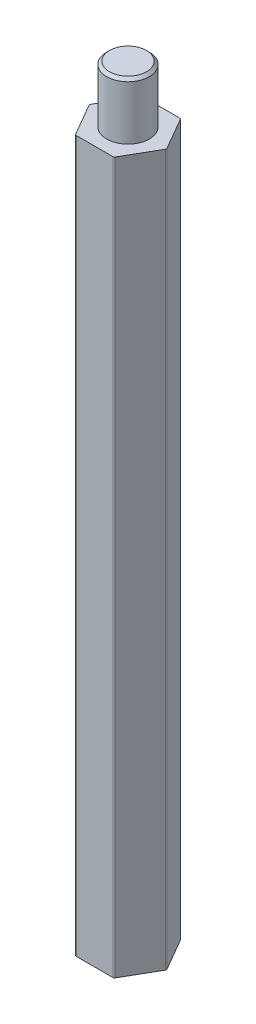
ISO-10303-21;
HEADER;
FILE_DESCRIPTION(('STEP AP214'),'2;1');
FILE_NAME('part.step','',(''),(''),'','','');
FILE_SCHEMA(('AUTOMOTIVE_DESIGN { 1 0 10303 214 1 1 1 1 }'));
ENDSEC;
DATA;
#1=APPLICATION_CONTEXT('core data for automotive mechanical design processes');
#2=APPLICATION_PROTOCOL_DEFINITION('international standard','automotive_design',2000,#1);
#3=PRODUCT_CONTEXT('',#1,'mechanical');
#4=PRODUCT('Part','Part','',(#3));
#5=PRODUCT_RELATED_PRODUCT_CATEGORY('part','',(#4));
#6=PRODUCT_DEFINITION_FORMATION('','',#4);
#7=PRODUCT_DEFINITION_CONTEXT('part definition',#1,'design');
#8=PRODUCT_DEFINITION('design','',#6,#7);
#9=PRODUCT_DEFINITION_SHAPE('','',#8);
#10=(LENGTH_UNIT() NAMED_UNIT(*) SI_UNIT(.MILLI.,.METRE.));
#11=(NAMED_UNIT(*) PLANE_ANGLE_UNIT() SI_UNIT($,.RADIAN.));
#12=(NAMED_UNIT(*) SI_UNIT($,.STERADIAN.) SOLID_ANGLE_UNIT());
#13=UNCERTAINTY_MEASURE_WITH_UNIT(LENGTH_MEASURE(1.E-05),#10,'distance_accuracy_value','');
#14=(GEOMETRIC_REPRESENTATION_CONTEXT(3) GLOBAL_UNCERTAINTY_ASSIGNED_CONTEXT((#13)) GLOBAL_UNIT_ASSIGNED_CONTEXT((#10,
#11,#12)) REPRESENTATION_CONTEXT('',''));
#15=CARTESIAN_POINT('',(0.,0.,0.));
#16=DIRECTION('',(0.,0.,1.));
#17=DIRECTION('',(1.,0.,0.));
#18=AXIS2_PLACEMENT_3D('',#15,#16,#17);
#19=CARTESIAN_POINT('',(1.35677313259565,50.,2.34999999999999));
#20=DIRECTION('',(-0.866025403784442,0.,-0.499999999999995));
#21=DIRECTION('',(-0.499999999999995,0.,0.866025403784442));
#22=AXIS2_PLACEMENT_3D('',#19,#20,#21);
#23=PLANE('',#22);
#24=DIRECTION('',(0.499999999999995,0.,-0.866025403784441));
#25=VECTOR('',#24,1.);
#26=CARTESIAN_POINT('',(1.35677313259565,50.,2.34999999999999));
#27=LINE('',#26,#25);
#28=CARTESIAN_POINT('',(1.38564064605513,50.,2.29999999999999));
#29=VERTEX_POINT('',#28);
#30=CARTESIAN_POINT('',(2.68467875173176,50.,0.0500000000000001));
#31=VERTEX_POINT('',#30);
#32=EDGE_CURVE('E152',#29,#31,#27,.T.);
#33=ORIENTED_EDGE('',*,*,#32,.F.);
#34=DIRECTION('',(0.,-1.,0.));
#35=VECTOR('',#34,1.);
#36=CARTESIAN_POINT('',(1.38564064605513,50.,2.29999999999999));
#37=LINE('',#36,#35);
#38=CARTESIAN_POINT('',(1.38564064605513,0.,2.29999999999999));
#39=VERTEX_POINT('',#38);
#40=EDGE_CURVE('E137',#29,#39,#37,.T.);
#41=ORIENTED_EDGE('',*,*,#40,.T.);
#42=DIRECTION('',(0.499999999999995,0.,-0.866025403784441));
#43=VECTOR('',#42,1.);
#44=CARTESIAN_POINT('',(1.35677313259565,0.,2.34999999999999));
#45=LINE('',#44,#43);
#46=CARTESIAN_POINT('',(2.68467875173176,0.,0.0500000000000001));
#47=VERTEX_POINT('',#46);
#48=EDGE_CURVE('E149',#39,#47,#45,.T.);
#49=ORIENTED_EDGE('',*,*,#48,.T.);
#50=DIRECTION('',(0.,-1.,0.));
#51=VECTOR('',#50,1.);
#52=CARTESIAN_POINT('',(2.68467875173176,50.,0.0499999999999997));
#53=LINE('',#52,#51);
#54=EDGE_CURVE('E154',#47,#31,#53,.F.);
#55=ORIENTED_EDGE('',*,*,#54,.T.);
#56=EDGE_LOOP('',(#33,#41,#49,#55));
#57=FACE_BOUND('',#56,.T.);
#58=ADVANCED_FACE('F43',(#57),#23,.F.);
#59=CARTESIAN_POINT('',(2.71354626519124,50.,0.));
#60=DIRECTION('',(-0.866025403784438,0.,0.500000000000001));
#61=DIRECTION('',(0.500000000000001,0.,0.866025403784438));
#62=AXIS2_PLACEMENT_3D('',#59,#60,#61);
#63=PLANE('',#62);
#64=DIRECTION('',(-0.500000000000001,0.,-0.866025403784438));
#65=VECTOR('',#64,1.);
#66=CARTESIAN_POINT('',(2.71354626519124,0.,0.));
#67=LINE('',#66,#65);
#68=CARTESIAN_POINT('',(2.68467875173176,0.,-0.0499999999999997));
#69=VERTEX_POINT('',#68);
#70=CARTESIAN_POINT('',(1.3856406460551,0.,-2.30000000000001));
#71=VERTEX_POINT('',#70);
#72=EDGE_CURVE('E158',#69,#71,#67,.T.);
#73=ORIENTED_EDGE('',*,*,#72,.T.);
#74=DIRECTION('',(0.,-1.,0.));
#75=VECTOR('',#74,1.);
#76=CARTESIAN_POINT('',(1.3856406460551,50.,-2.30000000000001));
#77=LINE('',#76,#75);
#78=CARTESIAN_POINT('',(1.3856406460551,50.,-2.30000000000001));
#79=VERTEX_POINT('',#78);
#80=EDGE_CURVE('E11',#71,#79,#77,.F.);
#81=ORIENTED_EDGE('',*,*,#80,.T.);
#82=DIRECTION('',(-0.500000000000001,0.,-0.866025403784438));
#83=VECTOR('',#82,1.);
#84=CARTESIAN_POINT('',(2.71354626519124,50.,0.));
#85=LINE('',#84,#83);
#86=CARTESIAN_POINT('',(2.68467875173176,50.,-0.0499999999999997));
#87=VERTEX_POINT('',#86);
#88=EDGE_CURVE('E235',#87,#79,#85,.T.);
#89=ORIENTED_EDGE('',*,*,#88,.F.);
#90=DIRECTION('',(0.,-1.,0.));
#91=VECTOR('',#90,1.);
#92=CARTESIAN_POINT('',(2.68467875173176,50.,-0.0499999999999997));
#93=LINE('',#92,#91);
#94=EDGE_CURVE('E51',#87,#69,#93,.T.);
#95=ORIENTED_EDGE('',*,*,#94,.T.);
#96=EDGE_LOOP('',(#73,#81,#89,#95));
#97=FACE_BOUND('',#96,.T.);
#98=ADVANCED_FACE('F232',(#97),#63,.F.);
#99=CARTESIAN_POINT('',(1.35677313259562,50.,-2.35000000000001));
#100=DIRECTION('',(0.,0.,1.));
#101=DIRECTION('',(1.,0.,0.));
#102=AXIS2_PLACEMENT_3D('',#99,#100,#101);
#103=PLANE('',#102);
#104=DIRECTION('',(-1.,0.,0.));
#105=VECTOR('',#104,1.);
#106=CARTESIAN_POINT('',(1.35677313259562,0.,-2.35000000000001));
#107=LINE('',#106,#105);
#108=CARTESIAN_POINT('',(1.29903810567665,0.,-2.35000000000001));
#109=VERTEX_POINT('',#108);
#110=CARTESIAN_POINT('',(-1.29903810567667,0.,-2.35));
#111=VERTEX_POINT('',#110);
#112=EDGE_CURVE('E162',#109,#111,#107,.T.);
#113=ORIENTED_EDGE('',*,*,#112,.T.);
#114=DIRECTION('',(0.,-1.,0.));
#115=VECTOR('',#114,1.);
#116=CARTESIAN_POINT('',(-1.29903810567667,50.,-2.35));
#117=LINE('',#116,#115);
#118=CARTESIAN_POINT('',(-1.29903810567667,50.,-2.35));
#119=VERTEX_POINT('',#118);
#120=EDGE_CURVE('E227',#111,#119,#117,.F.);
#121=ORIENTED_EDGE('',*,*,#120,.T.);
#122=DIRECTION('',(-1.,0.,0.));
#123=VECTOR('',#122,1.);
#124=CARTESIAN_POINT('',(1.35677313259562,50.,-2.35000000000001));
#125=LINE('',#124,#123);
#126=CARTESIAN_POINT('',(1.29903810567665,50.,-2.35000000000001));
#127=VERTEX_POINT('',#126);
#128=EDGE_CURVE('E248',#127,#119,#125,.T.);
#129=ORIENTED_EDGE('',*,*,#128,.F.);
#130=DIRECTION('',(0.,-1.,0.));
#131=VECTOR('',#130,1.);
#132=CARTESIAN_POINT('',(1.29903810567665,50.,-2.35000000000001));
#133=LINE('',#132,#131);
#134=EDGE_CURVE('E224',#127,#109,#133,.T.);
#135=ORIENTED_EDGE('',*,*,#134,.T.);
#136=EDGE_LOOP('',(#113,#121,#129,#135));
#137=FACE_BOUND('',#136,.T.);
#138=ADVANCED_FACE('F245',(#137),#103,.F.);
#139=CARTESIAN_POINT('',(-1.35677313259563,50.,-2.35));
#140=DIRECTION('',(0.866025403784441,0.,0.499999999999995));
#141=DIRECTION('',(0.499999999999995,0.,-0.866025403784442));
#142=AXIS2_PLACEMENT_3D('',#139,#140,#141);
#143=PLANE('',#142);
#144=DIRECTION('',(-0.499999999999995,0.,0.866025403784441));
#145=VECTOR('',#144,1.);
#146=CARTESIAN_POINT('',(-1.35677313259563,0.,-2.35));
#147=LINE('',#146,#145);
#148=CARTESIAN_POINT('',(-1.38564064605511,0.,-2.3));
#149=VERTEX_POINT('',#148);
#150=CARTESIAN_POINT('',(-2.68467875173176,0.,-0.0499999999999819));
#151=VERTEX_POINT('',#150);
#152=EDGE_CURVE('E173',#149,#151,#147,.T.);
#153=ORIENTED_EDGE('',*,*,#152,.T.);
#154=DIRECTION('',(0.,-1.,0.));
#155=VECTOR('',#154,1.);
#156=CARTESIAN_POINT('',(-2.68467875173176,50.,-0.0499999999999806));
#157=LINE('',#156,#155);
#158=CARTESIAN_POINT('',(-2.68467875173176,50.,-0.0499999999999819));
#159=VERTEX_POINT('',#158);
#160=EDGE_CURVE('E222',#151,#159,#157,.F.);
#161=ORIENTED_EDGE('',*,*,#160,.T.);
#162=DIRECTION('',(-0.499999999999995,0.,0.866025403784441));
#163=VECTOR('',#162,1.);
#164=CARTESIAN_POINT('',(-1.35677313259563,50.,-2.35));
#165=LINE('',#164,#163);
#166=CARTESIAN_POINT('',(-1.38564064605511,50.,-2.3));
#167=VERTEX_POINT('',#166);
#168=EDGE_CURVE('E250',#167,#159,#165,.T.);
#169=ORIENTED_EDGE('',*,*,#168,.F.);
#170=DIRECTION('',(0.,-1.,0.));
#171=VECTOR('',#170,1.);
#172=CARTESIAN_POINT('',(-1.38564064605511,50.,-2.3));
#173=LINE('',#172,#171);
#174=EDGE_CURVE('E219',#167,#149,#173,.T.);
#175=ORIENTED_EDGE('',*,*,#174,.T.);
#176=EDGE_LOOP('',(#153,#161,#169,#175));
#177=FACE_BOUND('',#176,.T.);
#178=ADVANCED_FACE('F273',(#177),#143,.F.);
#179=CARTESIAN_POINT('',(-2.71354626519124,50.,0.));
#180=DIRECTION('',(0.866025403784435,0.,-0.500000000000007));
#181=DIRECTION('',(-0.500000000000007,0.,-0.866025403784435));
#182=AXIS2_PLACEMENT_3D('',#179,#180,#181);
#183=PLANE('',#182);
#184=DIRECTION('',(0.500000000000007,0.,0.866025403784435));
#185=VECTOR('',#184,1.);
#186=CARTESIAN_POINT('',(-2.71354626519124,0.,0.));
#187=LINE('',#186,#185);
#188=CARTESIAN_POINT('',(-2.68467875173176,0.,0.0500000000000189));
#189=VERTEX_POINT('',#188);
#190=CARTESIAN_POINT('',(-1.38564064605508,0.,2.30000000000001));
#191=VERTEX_POINT('',#190);
#192=EDGE_CURVE('E176',#189,#191,#187,.T.);
#193=ORIENTED_EDGE('',*,*,#192,.T.);
#194=DIRECTION('',(0.,-1.,0.));
#195=VECTOR('',#194,1.);
#196=CARTESIAN_POINT('',(-1.38564064605508,50.,2.30000000000001));
#197=LINE('',#196,#195);
#198=CARTESIAN_POINT('',(-1.38564064605508,50.,2.30000000000001));
#199=VERTEX_POINT('',#198);
#200=EDGE_CURVE('E58',#191,#199,#197,.F.);
#201=ORIENTED_EDGE('',*,*,#200,.T.);
#202=DIRECTION('',(0.500000000000007,0.,0.866025403784435));
#203=VECTOR('',#202,1.);
#204=CARTESIAN_POINT('',(-2.71354626519124,50.,0.));
#205=LINE('',#204,#203);
#206=CARTESIAN_POINT('',(-2.68467875173176,50.,0.0500000000000189));
#207=VERTEX_POINT('',#206);
#208=EDGE_CURVE('E252',#207,#199,#205,.T.);
#209=ORIENTED_EDGE('',*,*,#208,.F.);
#210=DIRECTION('',(0.,-1.,0.));
#211=VECTOR('',#210,1.);
#212=CARTESIAN_POINT('',(-2.68467875173176,50.,0.0500000000000189));
#213=LINE('',#212,#211);
#214=EDGE_CURVE('E215',#207,#189,#213,.T.);
#215=ORIENTED_EDGE('',*,*,#214,.T.);
#216=EDGE_LOOP('',(#193,#201,#209,#215));
#217=FACE_BOUND('',#216,.T.);
#218=ADVANCED_FACE('F266',(#217),#183,.F.);
#219=CARTESIAN_POINT('',(-1.3567731325956,50.,2.35000000000001));
#220=DIRECTION('',(0.,0.,-1.));
#221=DIRECTION('',(-1.,0.,0.));
#222=AXIS2_PLACEMENT_3D('',#219,#220,#221);
#223=PLANE('',#222);
#224=DIRECTION('',(1.,0.,0.));
#225=VECTOR('',#224,1.);
#226=CARTESIAN_POINT('',(-1.3567731325956,0.,2.35000000000001));
#227=LINE('',#226,#225);
#228=CARTESIAN_POINT('',(-1.29903810567664,0.,2.35000000000001));
#229=VERTEX_POINT('',#228);
#230=CARTESIAN_POINT('',(1.29903810567669,0.,2.34999999999999));
#231=VERTEX_POINT('',#230);
#232=EDGE_CURVE('E178',#229,#231,#227,.T.);
#233=ORIENTED_EDGE('',*,*,#232,.T.);
#234=DIRECTION('',(0.,-1.,0.));
#235=VECTOR('',#234,1.);
#236=CARTESIAN_POINT('',(1.29903810567669,50.,2.34999999999999));
#237=LINE('',#236,#235);
#238=CARTESIAN_POINT('',(1.29903810567669,50.,2.34999999999999));
#239=VERTEX_POINT('',#238);
#240=EDGE_CURVE('E138',#231,#239,#237,.F.);
#241=ORIENTED_EDGE('',*,*,#240,.T.);
#242=DIRECTION('',(1.,0.,0.));
#243=VECTOR('',#242,1.);
#244=CARTESIAN_POINT('',(-1.3567731325956,50.,2.35000000000001));
#245=LINE('',#244,#243);
#246=CARTESIAN_POINT('',(-1.29903810567664,50.,2.35000000000001));
#247=VERTEX_POINT('',#246);
#248=EDGE_CURVE('E168',#247,#239,#245,.T.);
#249=ORIENTED_EDGE('',*,*,#248,.F.);
#250=DIRECTION('',(0.,-1.,0.));
#251=VECTOR('',#250,1.);
#252=CARTESIAN_POINT('',(-1.29903810567664,50.,2.35000000000001));
#253=LINE('',#252,#251);
#254=EDGE_CURVE('E143',#247,#229,#253,.T.);
#255=ORIENTED_EDGE('',*,*,#254,.T.);
#256=EDGE_LOOP('',(#233,#241,#249,#255));
#257=FACE_BOUND('',#256,.T.);
#258=ADVANCED_FACE('F262',(#257),#223,.F.);
#259=CARTESIAN_POINT('',(0.,50.,0.));
#260=DIRECTION('',(0.,1.,0.));
#261=DIRECTION('',(0.,0.,1.));
#262=AXIS2_PLACEMENT_3D('',#259,#260,#261);
#263=PLANE('',#262);
#264=CARTESIAN_POINT('',(0.,50.,0.));
#265=DIRECTION('',(0.,1.,0.));
#266=DIRECTION('',(0.,0.,1.));
#267=AXIS2_PLACEMENT_3D('',#264,#265,#266);
#268=CIRCLE('',#267,1.5);
#269=CARTESIAN_POINT('',(0.,50.,1.5));
#270=VERTEX_POINT('',#269);
#271=EDGE_CURVE('E159',#270,#270,#268,.T.);
#272=ORIENTED_EDGE('',*,*,#271,.F.);
#273=EDGE_LOOP('',(#272));
#274=FACE_BOUND('',#273,.T.);
#275=ORIENTED_EDGE('',*,*,#248,.T.);
#276=CARTESIAN_POINT('',(1.29903810567669,50.,2.24999999999999));
#277=DIRECTION('',(0.,1.,0.));
#278=DIRECTION('',(0.,0.,1.));
#279=AXIS2_PLACEMENT_3D('',#276,#277,#278);
#280=CIRCLE('',#279,0.1);
#281=EDGE_CURVE('E213',#239,#29,#280,.T.);
#282=ORIENTED_EDGE('',*,*,#281,.T.);
#283=ORIENTED_EDGE('',*,*,#32,.T.);
#284=CARTESIAN_POINT('',(2.59807621135332,50.,0.));
#285=DIRECTION('',(0.,1.,0.));
#286=DIRECTION('',(0.,0.,1.));
#287=AXIS2_PLACEMENT_3D('',#284,#285,#286);
#288=CIRCLE('',#287,0.1);
#289=EDGE_CURVE('E204',#31,#87,#288,.T.);
#290=ORIENTED_EDGE('',*,*,#289,.T.);
#291=ORIENTED_EDGE('',*,*,#88,.T.);
#292=CARTESIAN_POINT('',(1.29903810567665,50.,-2.25000000000001));
#293=DIRECTION('',(0.,1.,0.));
#294=DIRECTION('',(0.,0.,1.));
#295=AXIS2_PLACEMENT_3D('',#292,#293,#294);
#296=CIRCLE('',#295,0.1);
#297=EDGE_CURVE('E206',#79,#127,#296,.T.);
#298=ORIENTED_EDGE('',*,*,#297,.T.);
#299=ORIENTED_EDGE('',*,*,#128,.T.);
#300=CARTESIAN_POINT('',(-1.29903810567667,50.,-2.25));
#301=DIRECTION('',(0.,1.,0.));
#302=DIRECTION('',(0.,0.,1.));
#303=AXIS2_PLACEMENT_3D('',#300,#301,#302);
#304=CIRCLE('',#303,0.1);
#305=EDGE_CURVE('E208',#119,#167,#304,.T.);
#306=ORIENTED_EDGE('',*,*,#305,.T.);
#307=ORIENTED_EDGE('',*,*,#168,.T.);
#308=CARTESIAN_POINT('',(-2.59807621135332,50.,0.));
#309=DIRECTION('',(0.,1.,0.));
#310=DIRECTION('',(0.,0.,1.));
#311=AXIS2_PLACEMENT_3D('',#308,#309,#310);
#312=CIRCLE('',#311,0.1);
#313=EDGE_CURVE('E65',#159,#207,#312,.T.);
#314=ORIENTED_EDGE('',*,*,#313,.T.);
#315=ORIENTED_EDGE('',*,*,#208,.T.);
#316=CARTESIAN_POINT('',(-1.29903810567664,50.,2.25000000000001));
#317=DIRECTION('',(0.,1.,0.));
#318=DIRECTION('',(0.,0.,1.));
#319=AXIS2_PLACEMENT_3D('',#316,#317,#318);
#320=CIRCLE('',#319,0.1);
#321=EDGE_CURVE('E211',#199,#247,#320,.T.);
#322=ORIENTED_EDGE('',*,*,#321,.T.);
#323=EDGE_LOOP('',(#275,#282,#283,#290,#291,#298,#299,#306,#307,#314,#315,#322));
#324=FACE_BOUND('',#323,.T.);
#325=ADVANCED_FACE('F259',(#274,#324),#263,.T.);
#326=CARTESIAN_POINT('',(0.,0.,0.));
#327=DIRECTION('',(0.,1.,0.));
#328=DIRECTION('',(0.,0.,1.));
#329=AXIS2_PLACEMENT_3D('',#326,#327,#328);
#330=PLANE('',#329);
#331=CARTESIAN_POINT('',(0.,0.,0.));
#332=DIRECTION('',(0.,-1.,0.));
#333=DIRECTION('',(0.,0.,-1.));
#334=AXIS2_PLACEMENT_3D('',#331,#332,#333);
#335=CIRCLE('',#334,1.5);
#336=CARTESIAN_POINT('',(0.,0.,-1.5));
#337=VERTEX_POINT('',#336);
#338=EDGE_CURVE('E165',#337,#337,#335,.T.);
#339=ORIENTED_EDGE('',*,*,#338,.F.);
#340=EDGE_LOOP('',(#339));
#341=FACE_BOUND('',#340,.T.);
#342=ORIENTED_EDGE('',*,*,#48,.F.);
#343=CARTESIAN_POINT('',(1.29903810567669,0.,2.24999999999999));
#344=DIRECTION('',(0.,1.,0.));
#345=DIRECTION('',(0.,0.,1.));
#346=AXIS2_PLACEMENT_3D('',#343,#344,#345);
#347=CIRCLE('',#346,0.1);
#348=EDGE_CURVE('E133',#39,#231,#347,.F.);
#349=ORIENTED_EDGE('',*,*,#348,.T.);
#350=ORIENTED_EDGE('',*,*,#232,.F.);
#351=CARTESIAN_POINT('',(-1.29903810567664,0.,2.25000000000001));
#352=DIRECTION('',(0.,1.,0.));
#353=DIRECTION('',(0.,0.,1.));
#354=AXIS2_PLACEMENT_3D('',#351,#352,#353);
#355=CIRCLE('',#354,0.1);
#356=EDGE_CURVE('E144',#229,#191,#355,.F.);
#357=ORIENTED_EDGE('',*,*,#356,.T.);
#358=ORIENTED_EDGE('',*,*,#192,.F.);
#359=CARTESIAN_POINT('',(-2.59807621135332,0.,0.));
#360=DIRECTION('',(0.,1.,0.));
#361=DIRECTION('',(0.,0.,1.));
#362=AXIS2_PLACEMENT_3D('',#359,#360,#361);
#363=CIRCLE('',#362,0.1);
#364=EDGE_CURVE('E198',#189,#151,#363,.F.);
#365=ORIENTED_EDGE('',*,*,#364,.T.);
#366=ORIENTED_EDGE('',*,*,#152,.F.);
#367=CARTESIAN_POINT('',(-1.29903810567667,0.,-2.25));
#368=DIRECTION('',(0.,1.,0.));
#369=DIRECTION('',(0.,0.,1.));
#370=AXIS2_PLACEMENT_3D('',#367,#368,#369);
#371=CIRCLE('',#370,0.1);
#372=EDGE_CURVE('E196',#149,#111,#371,.F.);
#373=ORIENTED_EDGE('',*,*,#372,.T.);
#374=ORIENTED_EDGE('',*,*,#112,.F.);
#375=CARTESIAN_POINT('',(1.29903810567665,0.,-2.25000000000001));
#376=DIRECTION('',(0.,1.,0.));
#377=DIRECTION('',(0.,0.,1.));
#378=AXIS2_PLACEMENT_3D('',#375,#376,#377);
#379=CIRCLE('',#378,0.1);
#380=EDGE_CURVE('E194',#109,#71,#379,.F.);
#381=ORIENTED_EDGE('',*,*,#380,.T.);
#382=ORIENTED_EDGE('',*,*,#72,.F.);
#383=CARTESIAN_POINT('',(2.59807621135332,0.,0.));
#384=DIRECTION('',(0.,1.,0.));
#385=DIRECTION('',(0.,0.,1.));
#386=AXIS2_PLACEMENT_3D('',#383,#384,#385);
#387=CIRCLE('',#386,0.1);
#388=EDGE_CURVE('E153',#69,#47,#387,.F.);
#389=ORIENTED_EDGE('',*,*,#388,.T.);
#390=EDGE_LOOP('',(#342,#349,#350,#357,#358,#365,#366,#373,#374,#381,#382,#389));
#391=FACE_BOUND('',#390,.T.);
#392=ADVANCED_FACE('F156',(#341,#391),#330,.F.);
#393=CARTESIAN_POINT('',(0.,54.,0.));
#394=DIRECTION('',(0.,-1.,0.));
#395=DIRECTION('',(0.,0.,-1.));
#396=AXIS2_PLACEMENT_3D('',#393,#394,#395);
#397=CYLINDRICAL_SURFACE('',#396,1.5);
#398=CARTESIAN_POINT('',(0.,53.8,0.));
#399=DIRECTION('',(0.,1.,0.));
#400=DIRECTION('',(0.,0.,1.));
#401=AXIS2_PLACEMENT_3D('',#398,#399,#400);
#402=CIRCLE('',#401,1.5);
#403=CARTESIAN_POINT('',(0.,53.8,1.5));
#404=VERTEX_POINT('',#403);
#405=EDGE_CURVE('E189',#404,#404,#402,.F.);
#406=ORIENTED_EDGE('',*,*,#405,.T.);
#407=EDGE_LOOP('',(#406));
#408=FACE_BOUND('',#407,.T.);
#409=ORIENTED_EDGE('',*,*,#271,.T.);
#410=EDGE_LOOP('',(#409));
#411=FACE_BOUND('',#410,.T.);
#412=ADVANCED_FACE('F342',(#408,#411),#397,.T.);
#413=CARTESIAN_POINT('',(0.,54.,0.));
#414=DIRECTION('',(0.,1.,0.));
#415=DIRECTION('',(0.,0.,1.));
#416=AXIS2_PLACEMENT_3D('',#413,#414,#415);
#417=PLANE('',#416);
#418=CARTESIAN_POINT('',(0.,54.,0.));
#419=DIRECTION('',(0.,1.,0.));
#420=DIRECTION('',(0.,0.,1.));
#421=AXIS2_PLACEMENT_3D('',#418,#419,#420);
#422=CIRCLE('',#421,1.3);
#423=CARTESIAN_POINT('',(0.,54.,1.3));
#424=VERTEX_POINT('',#423);
#425=EDGE_CURVE('E186',#424,#424,#422,.T.);
#426=ORIENTED_EDGE('',*,*,#425,.T.);
#427=EDGE_LOOP('',(#426));
#428=FACE_BOUND('',#427,.T.);
#429=ADVANCED_FACE('F348',(#428),#417,.T.);
#430=CARTESIAN_POINT('',(0.,4.,0.));
#431=DIRECTION('',(0.,-1.,0.));
#432=DIRECTION('',(0.,0.,-1.));
#433=AXIS2_PLACEMENT_3D('',#430,#431,#432);
#434=CYLINDRICAL_SURFACE('',#433,1.5);
#435=CARTESIAN_POINT('',(0.,3.8,0.));
#436=DIRECTION('',(0.,-1.,0.));
#437=DIRECTION('',(0.,0.,-1.));
#438=AXIS2_PLACEMENT_3D('',#435,#436,#437);
#439=CIRCLE('',#438,1.5);
#440=CARTESIAN_POINT('',(0.,3.8,-1.5));
#441=VERTEX_POINT('',#440);
#442=EDGE_CURVE('E183',#441,#441,#439,.F.);
#443=ORIENTED_EDGE('',*,*,#442,.T.);
#444=EDGE_LOOP('',(#443));
#445=FACE_BOUND('',#444,.T.);
#446=ORIENTED_EDGE('',*,*,#338,.T.);
#447=EDGE_LOOP('',(#446));
#448=FACE_BOUND('',#447,.T.);
#449=ADVANCED_FACE('F340',(#445,#448),#434,.F.);
#450=CARTESIAN_POINT('',(0.,4.,0.));
#451=DIRECTION('',(0.,-1.,0.));
#452=DIRECTION('',(0.,0.,-1.));
#453=AXIS2_PLACEMENT_3D('',#450,#451,#452);
#454=PLANE('',#453);
#455=CARTESIAN_POINT('',(0.,4.,0.));
#456=DIRECTION('',(0.,-1.,0.));
#457=DIRECTION('',(0.,0.,-1.));
#458=AXIS2_PLACEMENT_3D('',#455,#456,#457);
#459=CIRCLE('',#458,1.3);
#460=CARTESIAN_POINT('',(0.,4.,-1.3));
#461=VERTEX_POINT('',#460);
#462=EDGE_CURVE('E180',#461,#461,#459,.T.);
#463=ORIENTED_EDGE('',*,*,#462,.T.);
#464=EDGE_LOOP('',(#463));
#465=FACE_BOUND('',#464,.T.);
#466=ADVANCED_FACE('F298',(#465),#454,.T.);
#467=CARTESIAN_POINT('',(0.,4.,0.));
#468=DIRECTION('',(0.,-1.,0.));
#469=DIRECTION('',(0.,0.,-1.));
#470=AXIS2_PLACEMENT_3D('',#467,#468,#469);
#471=CONICAL_SURFACE('',#470,1.3,0.785398163397451);
#472=ORIENTED_EDGE('',*,*,#442,.F.);
#473=EDGE_LOOP('',(#472));
#474=FACE_BOUND('',#473,.T.);
#475=ORIENTED_EDGE('',*,*,#462,.F.);
#476=EDGE_LOOP('',(#475));
#477=FACE_BOUND('',#476,.T.);
#478=ADVANCED_FACE('F294',(#474,#477),#471,.F.);
#479=CARTESIAN_POINT('',(0.,54.,0.));
#480=DIRECTION('',(0.,-1.,0.));
#481=DIRECTION('',(0.,0.,-1.));
#482=AXIS2_PLACEMENT_3D('',#479,#480,#481);
#483=CONICAL_SURFACE('',#482,1.3,0.785398163397445);
#484=ORIENTED_EDGE('',*,*,#405,.F.);
#485=EDGE_LOOP('',(#484));
#486=FACE_BOUND('',#485,.T.);
#487=ORIENTED_EDGE('',*,*,#425,.F.);
#488=EDGE_LOOP('',(#487));
#489=FACE_BOUND('',#488,.T.);
#490=ADVANCED_FACE('F297',(#486,#489),#483,.T.);
#491=CARTESIAN_POINT('',(1.29903810567669,50.,2.24999999999999));
#492=DIRECTION('',(0.,-1.,0.));
#493=DIRECTION('',(0.,0.,-1.));
#494=AXIS2_PLACEMENT_3D('',#491,#492,#493);
#495=CYLINDRICAL_SURFACE('',#494,0.1);
#496=ORIENTED_EDGE('',*,*,#281,.F.);
#497=ORIENTED_EDGE('',*,*,#240,.F.);
#498=ORIENTED_EDGE('',*,*,#348,.F.);
#499=ORIENTED_EDGE('',*,*,#40,.F.);
#500=EDGE_LOOP('',(#496,#497,#498,#499));
#501=FACE_BOUND('',#500,.T.);
#502=ADVANCED_FACE('F136',(#501),#495,.T.);
#503=CARTESIAN_POINT('',(-1.29903810567664,50.,2.25000000000001));
#504=DIRECTION('',(0.,-1.,0.));
#505=DIRECTION('',(0.,0.,-1.));
#506=AXIS2_PLACEMENT_3D('',#503,#504,#505);
#507=CYLINDRICAL_SURFACE('',#506,0.1);
#508=ORIENTED_EDGE('',*,*,#321,.F.);
#509=ORIENTED_EDGE('',*,*,#200,.F.);
#510=ORIENTED_EDGE('',*,*,#356,.F.);
#511=ORIENTED_EDGE('',*,*,#254,.F.);
#512=EDGE_LOOP('',(#508,#509,#510,#511));
#513=FACE_BOUND('',#512,.T.);
#514=ADVANCED_FACE('F264',(#513),#507,.T.);
#515=CARTESIAN_POINT('',(-2.59807621135332,50.,0.));
#516=DIRECTION('',(0.,-1.,0.));
#517=DIRECTION('',(0.,0.,-1.));
#518=AXIS2_PLACEMENT_3D('',#515,#516,#517);
#519=CYLINDRICAL_SURFACE('',#518,0.1);
#520=ORIENTED_EDGE('',*,*,#313,.F.);
#521=ORIENTED_EDGE('',*,*,#160,.F.);
#522=ORIENTED_EDGE('',*,*,#364,.F.);
#523=ORIENTED_EDGE('',*,*,#214,.F.);
#524=EDGE_LOOP('',(#520,#521,#522,#523));
#525=FACE_BOUND('',#524,.T.);
#526=ADVANCED_FACE('F269',(#525),#519,.T.);
#527=CARTESIAN_POINT('',(-1.29903810567667,50.,-2.25));
#528=DIRECTION('',(0.,-1.,0.));
#529=DIRECTION('',(0.,0.,-1.));
#530=AXIS2_PLACEMENT_3D('',#527,#528,#529);
#531=CYLINDRICAL_SURFACE('',#530,0.1);
#532=ORIENTED_EDGE('',*,*,#305,.F.);
#533=ORIENTED_EDGE('',*,*,#120,.F.);
#534=ORIENTED_EDGE('',*,*,#372,.F.);
#535=ORIENTED_EDGE('',*,*,#174,.F.);
#536=EDGE_LOOP('',(#532,#533,#534,#535));
#537=FACE_BOUND('',#536,.T.);
#538=ADVANCED_FACE('F277',(#537),#531,.T.);
#539=CARTESIAN_POINT('',(1.29903810567665,50.,-2.25000000000001));
#540=DIRECTION('',(0.,-1.,0.));
#541=DIRECTION('',(0.,0.,-1.));
#542=AXIS2_PLACEMENT_3D('',#539,#540,#541);
#543=CYLINDRICAL_SURFACE('',#542,0.1);
#544=ORIENTED_EDGE('',*,*,#297,.F.);
#545=ORIENTED_EDGE('',*,*,#80,.F.);
#546=ORIENTED_EDGE('',*,*,#380,.F.);
#547=ORIENTED_EDGE('',*,*,#134,.F.);
#548=EDGE_LOOP('',(#544,#545,#546,#547));
#549=FACE_BOUND('',#548,.T.);
#550=ADVANCED_FACE('F242',(#549),#543,.T.);
#551=CARTESIAN_POINT('',(2.59807621135332,50.,0.));
#552=DIRECTION('',(0.,-1.,0.));
#553=DIRECTION('',(0.,0.,-1.));
#554=AXIS2_PLACEMENT_3D('',#551,#552,#553);
#555=CYLINDRICAL_SURFACE('',#554,0.1);
#556=ORIENTED_EDGE('',*,*,#289,.F.);
#557=ORIENTED_EDGE('',*,*,#54,.F.);
#558=ORIENTED_EDGE('',*,*,#388,.F.);
#559=ORIENTED_EDGE('',*,*,#94,.F.);
#560=EDGE_LOOP('',(#556,#557,#558,#559));
#561=FACE_BOUND('',#560,.T.);
#562=ADVANCED_FACE('F45',(#561),#555,.T.);
#563=CLOSED_SHELL('',(#58,#98,#138,#178,#218,#258,#325,#392,#412,#429,#449,#466,#478,#490,#502,
#514,#526,#538,#550,#562));
#564=MANIFOLD_SOLID_BREP('B2',#563);
#565=ADVANCED_BREP_SHAPE_REPRESENTATION('',(#18,#564),#14);
#566=SHAPE_DEFINITION_REPRESENTATION(#9,#565);
ENDSEC;
END-ISO-10303-21;
